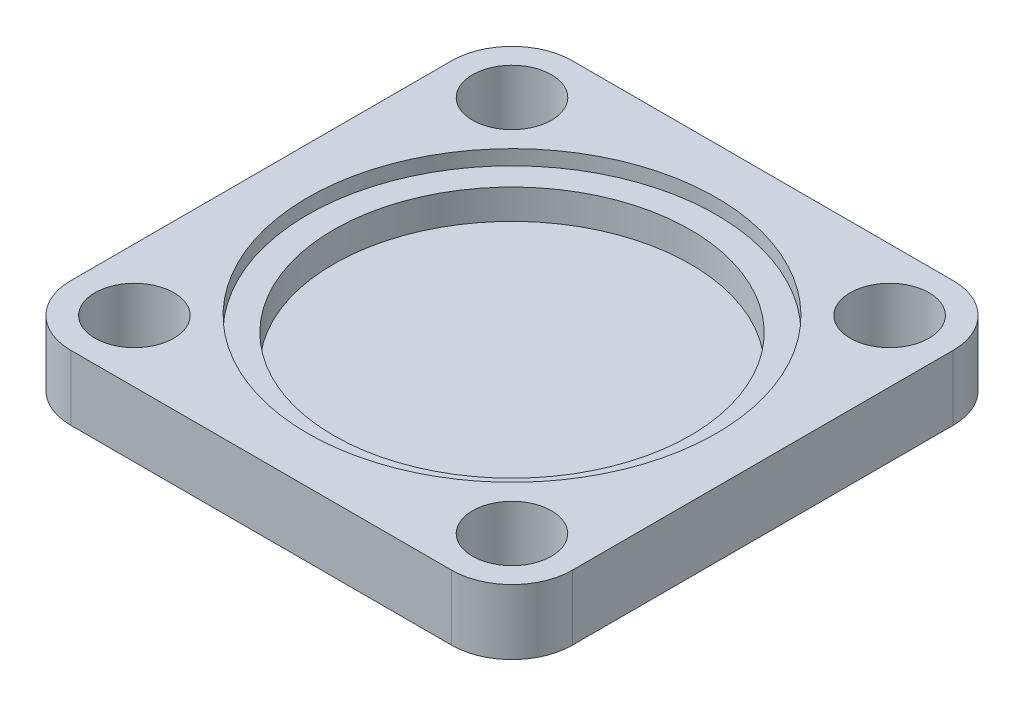
ISO-10303-21;
HEADER;
FILE_DESCRIPTION(('STEP AP214'),'2;1');
FILE_NAME('part.step','',(''),(''),'','','');
FILE_SCHEMA(('AUTOMOTIVE_DESIGN { 1 0 10303 214 1 1 1 1 }'));
ENDSEC;
DATA;
#1=APPLICATION_CONTEXT('core data for automotive mechanical design processes');
#2=APPLICATION_PROTOCOL_DEFINITION('international standard','automotive_design',2000,#1);
#3=PRODUCT_CONTEXT('',#1,'mechanical');
#4=PRODUCT('Part','Part','',(#3));
#5=PRODUCT_RELATED_PRODUCT_CATEGORY('part','',(#4));
#6=PRODUCT_DEFINITION_FORMATION('','',#4);
#7=PRODUCT_DEFINITION_CONTEXT('part definition',#1,'design');
#8=PRODUCT_DEFINITION('design','',#6,#7);
#9=PRODUCT_DEFINITION_SHAPE('','',#8);
#10=(LENGTH_UNIT() NAMED_UNIT(*) SI_UNIT(.MILLI.,.METRE.));
#11=(NAMED_UNIT(*) PLANE_ANGLE_UNIT() SI_UNIT($,.RADIAN.));
#12=(NAMED_UNIT(*) SI_UNIT($,.STERADIAN.) SOLID_ANGLE_UNIT());
#13=UNCERTAINTY_MEASURE_WITH_UNIT(LENGTH_MEASURE(1.E-05),#10,'distance_accuracy_value','');
#14=(GEOMETRIC_REPRESENTATION_CONTEXT(3) GLOBAL_UNCERTAINTY_ASSIGNED_CONTEXT((#13)) GLOBAL_UNIT_ASSIGNED_CONTEXT((#10,
#11,#12)) REPRESENTATION_CONTEXT('',''));
#15=CARTESIAN_POINT('',(0.,0.,0.));
#16=DIRECTION('',(0.,0.,1.));
#17=DIRECTION('',(1.,0.,0.));
#18=AXIS2_PLACEMENT_3D('',#15,#16,#17);
#19=CARTESIAN_POINT('',(0.,7.,0.));
#20=DIRECTION('',(0.,1.,0.));
#21=DIRECTION('',(0.,0.,1.));
#22=AXIS2_PLACEMENT_3D('',#19,#20,#21);
#23=PLANE('',#22);
#24=CARTESIAN_POINT('',(0.,7.,0.));
#25=DIRECTION('',(0.,1.,0.));
#26=DIRECTION('',(0.,0.,1.));
#27=AXIS2_PLACEMENT_3D('',#24,#25,#26);
#28=CIRCLE('',#27,22.);
#29=CARTESIAN_POINT('',(0.,7.,22.));
#30=VERTEX_POINT('',#29);
#31=EDGE_CURVE('E196',#30,#30,#28,.T.);
#32=ORIENTED_EDGE('',*,*,#31,.F.);
#33=EDGE_LOOP('',(#32));
#34=FACE_BOUND('',#33,.T.);
#35=CARTESIAN_POINT('',(-20.3293199591132,7.,20.3293199591132));
#36=DIRECTION('',(0.,1.,0.));
#37=DIRECTION('',(0.,0.,1.));
#38=AXIS2_PLACEMENT_3D('',#35,#36,#37);
#39=CIRCLE('',#38,4.25000000000001);
#40=CARTESIAN_POINT('',(-20.3293199591132,7.,24.5793199591133));
#41=VERTEX_POINT('',#40);
#42=EDGE_CURVE('E181',#41,#41,#39,.T.);
#43=ORIENTED_EDGE('',*,*,#42,.F.);
#44=EDGE_LOOP('',(#43));
#45=FACE_BOUND('',#44,.T.);
#46=CARTESIAN_POINT('',(-20.3293199591132,7.,-20.3293199591132));
#47=DIRECTION('',(0.,1.,0.));
#48=DIRECTION('',(0.,0.,1.));
#49=AXIS2_PLACEMENT_3D('',#46,#47,#48);
#50=CIRCLE('',#49,4.25);
#51=CARTESIAN_POINT('',(-20.3293199591132,7.,-16.0793199591132));
#52=VERTEX_POINT('',#51);
#53=EDGE_CURVE('E164',#52,#52,#50,.T.);
#54=ORIENTED_EDGE('',*,*,#53,.F.);
#55=EDGE_LOOP('',(#54));
#56=FACE_BOUND('',#55,.T.);
#57=DIRECTION('',(0.,0.,1.));
#58=VECTOR('',#57,1.);
#59=CARTESIAN_POINT('',(-27.,7.,-27.));
#60=LINE('',#59,#58);
#61=CARTESIAN_POINT('',(-27.,7.,-20.5));
#62=VERTEX_POINT('',#61);
#63=CARTESIAN_POINT('',(-27.,7.,20.5));
#64=VERTEX_POINT('',#63);
#65=EDGE_CURVE('E171',#62,#64,#60,.T.);
#66=ORIENTED_EDGE('',*,*,#65,.T.);
#67=CARTESIAN_POINT('',(-20.5,7.,20.5));
#68=DIRECTION('',(0.,1.,0.));
#69=DIRECTION('',(0.,0.,1.));
#70=AXIS2_PLACEMENT_3D('',#67,#68,#69);
#71=CIRCLE('',#70,6.5);
#72=CARTESIAN_POINT('',(-20.5,7.,27.));
#73=VERTEX_POINT('',#72);
#74=EDGE_CURVE('E148',#64,#73,#71,.T.);
#75=ORIENTED_EDGE('',*,*,#74,.T.);
#76=DIRECTION('',(1.,0.,0.));
#77=VECTOR('',#76,1.);
#78=CARTESIAN_POINT('',(-27.,7.,27.));
#79=LINE('',#78,#77);
#80=CARTESIAN_POINT('',(20.5,7.,27.));
#81=VERTEX_POINT('',#80);
#82=EDGE_CURVE('E119',#73,#81,#79,.T.);
#83=ORIENTED_EDGE('',*,*,#82,.T.);
#84=CARTESIAN_POINT('',(20.5,7.,20.5));
#85=DIRECTION('',(0.,1.,0.));
#86=DIRECTION('',(0.,0.,1.));
#87=AXIS2_PLACEMENT_3D('',#84,#85,#86);
#88=CIRCLE('',#87,6.5);
#89=CARTESIAN_POINT('',(27.,7.,20.5));
#90=VERTEX_POINT('',#89);
#91=EDGE_CURVE('E146',#81,#90,#88,.T.);
#92=ORIENTED_EDGE('',*,*,#91,.T.);
#93=DIRECTION('',(0.,0.,-1.));
#94=VECTOR('',#93,1.);
#95=CARTESIAN_POINT('',(27.,7.,-27.));
#96=LINE('',#95,#94);
#97=CARTESIAN_POINT('',(27.,7.,-20.5));
#98=VERTEX_POINT('',#97);
#99=EDGE_CURVE('E126',#90,#98,#96,.T.);
#100=ORIENTED_EDGE('',*,*,#99,.T.);
#101=CARTESIAN_POINT('',(20.5,7.,-20.5));
#102=DIRECTION('',(0.,1.,0.));
#103=DIRECTION('',(0.,0.,1.));
#104=AXIS2_PLACEMENT_3D('',#101,#102,#103);
#105=CIRCLE('',#104,6.5);
#106=CARTESIAN_POINT('',(20.5,7.,-27.));
#107=VERTEX_POINT('',#106);
#108=EDGE_CURVE('E54',#98,#107,#105,.T.);
#109=ORIENTED_EDGE('',*,*,#108,.T.);
#110=DIRECTION('',(-1.,0.,0.));
#111=VECTOR('',#110,1.);
#112=CARTESIAN_POINT('',(-27.,7.,-27.));
#113=LINE('',#112,#111);
#114=CARTESIAN_POINT('',(-20.5,7.,-27.));
#115=VERTEX_POINT('',#114);
#116=EDGE_CURVE('E129',#107,#115,#113,.T.);
#117=ORIENTED_EDGE('',*,*,#116,.T.);
#118=CARTESIAN_POINT('',(-20.5,7.,-20.5));
#119=DIRECTION('',(0.,1.,0.));
#120=DIRECTION('',(0.,0.,1.));
#121=AXIS2_PLACEMENT_3D('',#118,#119,#120);
#122=CIRCLE('',#121,6.5);
#123=EDGE_CURVE('E143',#115,#62,#122,.T.);
#124=ORIENTED_EDGE('',*,*,#123,.T.);
#125=EDGE_LOOP('',(#66,#75,#83,#92,#100,#109,#117,#124));
#126=FACE_BOUND('',#125,.T.);
#127=CARTESIAN_POINT('',(20.3293199591132,7.,20.3293199591132));
#128=DIRECTION('',(0.,1.,0.));
#129=DIRECTION('',(0.,0.,-1.));
#130=AXIS2_PLACEMENT_3D('',#127,#128,#129);
#131=CIRCLE('',#130,4.25000000000001);
#132=CARTESIAN_POINT('',(20.3293199591132,7.,16.0793199591132));
#133=VERTEX_POINT('',#132);
#134=EDGE_CURVE('E176',#133,#133,#131,.T.);
#135=ORIENTED_EDGE('',*,*,#134,.F.);
#136=EDGE_LOOP('',(#135));
#137=FACE_BOUND('',#136,.T.);
#138=CARTESIAN_POINT('',(20.3293199591132,7.,-20.3293199591133));
#139=DIRECTION('',(0.,1.,0.));
#140=DIRECTION('',(0.,0.,-1.));
#141=AXIS2_PLACEMENT_3D('',#138,#139,#140);
#142=CIRCLE('',#141,4.25);
#143=CARTESIAN_POINT('',(20.3293199591132,7.,-24.5793199591133));
#144=VERTEX_POINT('',#143);
#145=EDGE_CURVE('E187',#144,#144,#142,.T.);
#146=ORIENTED_EDGE('',*,*,#145,.F.);
#147=EDGE_LOOP('',(#146));
#148=FACE_BOUND('',#147,.T.);
#149=ADVANCED_FACE('F33',(#34,#45,#56,#126,#137,#148),#23,.T.);
#150=CARTESIAN_POINT('',(0.,0.,0.));
#151=DIRECTION('',(0.,1.,0.));
#152=DIRECTION('',(0.,0.,1.));
#153=AXIS2_PLACEMENT_3D('',#150,#151,#152);
#154=PLANE('',#153);
#155=DIRECTION('',(1.,0.,0.));
#156=VECTOR('',#155,1.);
#157=CARTESIAN_POINT('',(-27.,0.,27.));
#158=LINE('',#157,#156);
#159=CARTESIAN_POINT('',(-20.5,0.,27.));
#160=VERTEX_POINT('',#159);
#161=CARTESIAN_POINT('',(20.5,0.,27.));
#162=VERTEX_POINT('',#161);
#163=EDGE_CURVE('E116',#160,#162,#158,.T.);
#164=ORIENTED_EDGE('',*,*,#163,.F.);
#165=CARTESIAN_POINT('',(-20.5,0.,20.5));
#166=DIRECTION('',(0.,1.,0.));
#167=DIRECTION('',(0.,0.,1.));
#168=AXIS2_PLACEMENT_3D('',#165,#166,#167);
#169=CIRCLE('',#168,6.5);
#170=CARTESIAN_POINT('',(-27.,0.,20.5));
#171=VERTEX_POINT('',#170);
#172=EDGE_CURVE('E99',#160,#171,#169,.F.);
#173=ORIENTED_EDGE('',*,*,#172,.T.);
#174=DIRECTION('',(0.,0.,1.));
#175=VECTOR('',#174,1.);
#176=CARTESIAN_POINT('',(-27.,0.,-27.));
#177=LINE('',#176,#175);
#178=CARTESIAN_POINT('',(-27.,0.,-20.5));
#179=VERTEX_POINT('',#178);
#180=EDGE_CURVE('E127',#179,#171,#177,.T.);
#181=ORIENTED_EDGE('',*,*,#180,.F.);
#182=CARTESIAN_POINT('',(-20.5,0.,-20.5));
#183=DIRECTION('',(0.,1.,0.));
#184=DIRECTION('',(0.,0.,1.));
#185=AXIS2_PLACEMENT_3D('',#182,#183,#184);
#186=CIRCLE('',#185,6.5);
#187=CARTESIAN_POINT('',(-20.5,0.,-27.));
#188=VERTEX_POINT('',#187);
#189=EDGE_CURVE('E120',#179,#188,#186,.F.);
#190=ORIENTED_EDGE('',*,*,#189,.T.);
#191=DIRECTION('',(-1.,0.,0.));
#192=VECTOR('',#191,1.);
#193=CARTESIAN_POINT('',(-27.,0.,-27.));
#194=LINE('',#193,#192);
#195=CARTESIAN_POINT('',(20.5,0.,-27.));
#196=VERTEX_POINT('',#195);
#197=EDGE_CURVE('E131',#196,#188,#194,.T.);
#198=ORIENTED_EDGE('',*,*,#197,.F.);
#199=CARTESIAN_POINT('',(20.5,0.,-20.5));
#200=DIRECTION('',(0.,1.,0.));
#201=DIRECTION('',(0.,0.,1.));
#202=AXIS2_PLACEMENT_3D('',#199,#200,#201);
#203=CIRCLE('',#202,6.5);
#204=CARTESIAN_POINT('',(27.,0.,-20.5));
#205=VERTEX_POINT('',#204);
#206=EDGE_CURVE('E137',#196,#205,#203,.F.);
#207=ORIENTED_EDGE('',*,*,#206,.T.);
#208=DIRECTION('',(0.,0.,-1.));
#209=VECTOR('',#208,1.);
#210=CARTESIAN_POINT('',(27.,0.,-27.));
#211=LINE('',#210,#209);
#212=CARTESIAN_POINT('',(27.,0.,20.5));
#213=VERTEX_POINT('',#212);
#214=EDGE_CURVE('E159',#213,#205,#211,.T.);
#215=ORIENTED_EDGE('',*,*,#214,.F.);
#216=CARTESIAN_POINT('',(20.5,0.,20.5));
#217=DIRECTION('',(0.,1.,0.));
#218=DIRECTION('',(0.,0.,1.));
#219=AXIS2_PLACEMENT_3D('',#216,#217,#218);
#220=CIRCLE('',#219,6.5);
#221=EDGE_CURVE('E110',#213,#162,#220,.F.);
#222=ORIENTED_EDGE('',*,*,#221,.T.);
#223=EDGE_LOOP('',(#164,#173,#181,#190,#198,#207,#215,#222));
#224=FACE_BOUND('',#223,.T.);
#225=CARTESIAN_POINT('',(-20.3293199591132,0.,-20.3293199591132));
#226=DIRECTION('',(0.,1.,0.));
#227=DIRECTION('',(0.,0.,1.));
#228=AXIS2_PLACEMENT_3D('',#225,#226,#227);
#229=CIRCLE('',#228,4.25);
#230=CARTESIAN_POINT('',(-20.3293199591132,0.,-16.0793199591132));
#231=VERTEX_POINT('',#230);
#232=EDGE_CURVE('E167',#231,#231,#229,.T.);
#233=ORIENTED_EDGE('',*,*,#232,.T.);
#234=EDGE_LOOP('',(#233));
#235=FACE_BOUND('',#234,.T.);
#236=CARTESIAN_POINT('',(20.3293199591132,0.,20.3293199591132));
#237=DIRECTION('',(0.,1.,0.));
#238=DIRECTION('',(0.,0.,-1.));
#239=AXIS2_PLACEMENT_3D('',#236,#237,#238);
#240=CIRCLE('',#239,4.25000000000001);
#241=CARTESIAN_POINT('',(20.3293199591132,0.,16.0793199591132));
#242=VERTEX_POINT('',#241);
#243=EDGE_CURVE('E178',#242,#242,#240,.T.);
#244=ORIENTED_EDGE('',*,*,#243,.T.);
#245=EDGE_LOOP('',(#244));
#246=FACE_BOUND('',#245,.T.);
#247=CARTESIAN_POINT('',(-20.3293199591132,0.,20.3293199591132));
#248=DIRECTION('',(0.,1.,0.));
#249=DIRECTION('',(0.,0.,1.));
#250=AXIS2_PLACEMENT_3D('',#247,#248,#249);
#251=CIRCLE('',#250,4.25000000000001);
#252=CARTESIAN_POINT('',(-20.3293199591132,0.,24.5793199591133));
#253=VERTEX_POINT('',#252);
#254=EDGE_CURVE('E184',#253,#253,#251,.T.);
#255=ORIENTED_EDGE('',*,*,#254,.T.);
#256=EDGE_LOOP('',(#255));
#257=FACE_BOUND('',#256,.T.);
#258=CARTESIAN_POINT('',(20.3293199591132,0.,-20.3293199591133));
#259=DIRECTION('',(0.,1.,0.));
#260=DIRECTION('',(0.,0.,-1.));
#261=AXIS2_PLACEMENT_3D('',#258,#259,#260);
#262=CIRCLE('',#261,4.25);
#263=CARTESIAN_POINT('',(20.3293199591132,0.,-24.5793199591133));
#264=VERTEX_POINT('',#263);
#265=EDGE_CURVE('E190',#264,#264,#262,.T.);
#266=ORIENTED_EDGE('',*,*,#265,.T.);
#267=EDGE_LOOP('',(#266));
#268=FACE_BOUND('',#267,.T.);
#269=ADVANCED_FACE('F123',(#224,#235,#246,#257,#268),#154,.F.);
#270=CARTESIAN_POINT('',(27.,7.,-27.));
#271=DIRECTION('',(-1.,0.,0.));
#272=DIRECTION('',(0.,0.,1.));
#273=AXIS2_PLACEMENT_3D('',#270,#271,#272);
#274=PLANE('',#273);
#275=ORIENTED_EDGE('',*,*,#99,.F.);
#276=DIRECTION('',(0.,-1.,0.));
#277=VECTOR('',#276,1.);
#278=CARTESIAN_POINT('',(27.,7.,20.5));
#279=LINE('',#278,#277);
#280=EDGE_CURVE('E152',#90,#213,#279,.T.);
#281=ORIENTED_EDGE('',*,*,#280,.T.);
#282=ORIENTED_EDGE('',*,*,#214,.T.);
#283=DIRECTION('',(0.,-1.,0.));
#284=VECTOR('',#283,1.);
#285=CARTESIAN_POINT('',(27.,7.,-20.5));
#286=LINE('',#285,#284);
#287=EDGE_CURVE('E150',#205,#98,#286,.F.);
#288=ORIENTED_EDGE('',*,*,#287,.T.);
#289=EDGE_LOOP('',(#275,#281,#282,#288));
#290=FACE_BOUND('',#289,.T.);
#291=ADVANCED_FACE('F158',(#290),#274,.F.);
#292=CARTESIAN_POINT('',(-27.,7.,-27.));
#293=DIRECTION('',(0.,0.,1.));
#294=DIRECTION('',(1.,0.,0.));
#295=AXIS2_PLACEMENT_3D('',#292,#293,#294);
#296=PLANE('',#295);
#297=ORIENTED_EDGE('',*,*,#116,.F.);
#298=DIRECTION('',(0.,-1.,0.));
#299=VECTOR('',#298,1.);
#300=CARTESIAN_POINT('',(20.5,7.,-27.));
#301=LINE('',#300,#299);
#302=EDGE_CURVE('E11',#107,#196,#301,.T.);
#303=ORIENTED_EDGE('',*,*,#302,.T.);
#304=ORIENTED_EDGE('',*,*,#197,.T.);
#305=DIRECTION('',(0.,-1.,0.));
#306=VECTOR('',#305,1.);
#307=CARTESIAN_POINT('',(-20.5,7.,-27.));
#308=LINE('',#307,#306);
#309=EDGE_CURVE('E41',#188,#115,#308,.F.);
#310=ORIENTED_EDGE('',*,*,#309,.T.);
#311=EDGE_LOOP('',(#297,#303,#304,#310));
#312=FACE_BOUND('',#311,.T.);
#313=ADVANCED_FACE('F252',(#312),#296,.F.);
#314=CARTESIAN_POINT('',(-27.,7.,-27.));
#315=DIRECTION('',(1.,0.,0.));
#316=DIRECTION('',(0.,0.,-1.));
#317=AXIS2_PLACEMENT_3D('',#314,#315,#316);
#318=PLANE('',#317);
#319=ORIENTED_EDGE('',*,*,#180,.T.);
#320=DIRECTION('',(0.,-1.,0.));
#321=VECTOR('',#320,1.);
#322=CARTESIAN_POINT('',(-27.,7.,20.5));
#323=LINE('',#322,#321);
#324=EDGE_CURVE('E104',#171,#64,#323,.F.);
#325=ORIENTED_EDGE('',*,*,#324,.T.);
#326=ORIENTED_EDGE('',*,*,#65,.F.);
#327=DIRECTION('',(0.,-1.,0.));
#328=VECTOR('',#327,1.);
#329=CARTESIAN_POINT('',(-27.,7.,-20.5));
#330=LINE('',#329,#328);
#331=EDGE_CURVE('E109',#62,#179,#330,.T.);
#332=ORIENTED_EDGE('',*,*,#331,.T.);
#333=EDGE_LOOP('',(#319,#325,#326,#332));
#334=FACE_BOUND('',#333,.T.);
#335=ADVANCED_FACE('F259',(#334),#318,.F.);
#336=CARTESIAN_POINT('',(-27.,7.,27.));
#337=DIRECTION('',(0.,0.,-1.));
#338=DIRECTION('',(-1.,0.,0.));
#339=AXIS2_PLACEMENT_3D('',#336,#337,#338);
#340=PLANE('',#339);
#341=ORIENTED_EDGE('',*,*,#82,.F.);
#342=DIRECTION('',(0.,-1.,0.));
#343=VECTOR('',#342,1.);
#344=CARTESIAN_POINT('',(-20.5,7.,27.));
#345=LINE('',#344,#343);
#346=EDGE_CURVE('E103',#73,#160,#345,.T.);
#347=ORIENTED_EDGE('',*,*,#346,.T.);
#348=ORIENTED_EDGE('',*,*,#163,.T.);
#349=DIRECTION('',(0.,-1.,0.));
#350=VECTOR('',#349,1.);
#351=CARTESIAN_POINT('',(20.5,7.,27.));
#352=LINE('',#351,#350);
#353=EDGE_CURVE('E121',#162,#81,#352,.F.);
#354=ORIENTED_EDGE('',*,*,#353,.T.);
#355=EDGE_LOOP('',(#341,#347,#348,#354));
#356=FACE_BOUND('',#355,.T.);
#357=ADVANCED_FACE('F115',(#356),#340,.F.);
#358=CARTESIAN_POINT('',(-20.3293199591132,7.,-20.3293199591132));
#359=DIRECTION('',(0.,-1.,0.));
#360=DIRECTION('',(0.,0.,-1.));
#361=AXIS2_PLACEMENT_3D('',#358,#359,#360);
#362=CYLINDRICAL_SURFACE('',#361,4.25);
#363=ORIENTED_EDGE('',*,*,#53,.T.);
#364=EDGE_LOOP('',(#363));
#365=FACE_BOUND('',#364,.T.);
#366=ORIENTED_EDGE('',*,*,#232,.F.);
#367=EDGE_LOOP('',(#366));
#368=FACE_BOUND('',#367,.T.);
#369=ADVANCED_FACE('F258',(#365,#368),#362,.F.);
#370=CARTESIAN_POINT('',(20.3293199591132,7.,20.3293199591132));
#371=DIRECTION('',(0.,-1.,0.));
#372=DIRECTION('',(0.,0.,-1.));
#373=AXIS2_PLACEMENT_3D('',#370,#371,#372);
#374=CYLINDRICAL_SURFACE('',#373,4.25000000000001);
#375=ORIENTED_EDGE('',*,*,#134,.T.);
#376=EDGE_LOOP('',(#375));
#377=FACE_BOUND('',#376,.T.);
#378=ORIENTED_EDGE('',*,*,#243,.F.);
#379=EDGE_LOOP('',(#378));
#380=FACE_BOUND('',#379,.T.);
#381=ADVANCED_FACE('F338',(#377,#380),#374,.F.);
#382=CARTESIAN_POINT('',(-20.3293199591132,7.,20.3293199591132));
#383=DIRECTION('',(0.,-1.,0.));
#384=DIRECTION('',(0.,0.,-1.));
#385=AXIS2_PLACEMENT_3D('',#382,#383,#384);
#386=CYLINDRICAL_SURFACE('',#385,4.25000000000001);
#387=ORIENTED_EDGE('',*,*,#42,.T.);
#388=EDGE_LOOP('',(#387));
#389=FACE_BOUND('',#388,.T.);
#390=ORIENTED_EDGE('',*,*,#254,.F.);
#391=EDGE_LOOP('',(#390));
#392=FACE_BOUND('',#391,.T.);
#393=ADVANCED_FACE('F243',(#389,#392),#386,.F.);
#394=CARTESIAN_POINT('',(20.3293199591132,7.,-20.3293199591133));
#395=DIRECTION('',(0.,-1.,0.));
#396=DIRECTION('',(0.,0.,-1.));
#397=AXIS2_PLACEMENT_3D('',#394,#395,#396);
#398=CYLINDRICAL_SURFACE('',#397,4.25);
#399=ORIENTED_EDGE('',*,*,#145,.T.);
#400=EDGE_LOOP('',(#399));
#401=FACE_BOUND('',#400,.T.);
#402=ORIENTED_EDGE('',*,*,#265,.F.);
#403=EDGE_LOOP('',(#402));
#404=FACE_BOUND('',#403,.T.);
#405=ADVANCED_FACE('F240',(#401,#404),#398,.F.);
#406=CARTESIAN_POINT('',(-20.5,7.,20.5));
#407=DIRECTION('',(0.,-1.,0.));
#408=DIRECTION('',(0.,0.,-1.));
#409=AXIS2_PLACEMENT_3D('',#406,#407,#408);
#410=CYLINDRICAL_SURFACE('',#409,6.5);
#411=ORIENTED_EDGE('',*,*,#74,.F.);
#412=ORIENTED_EDGE('',*,*,#324,.F.);
#413=ORIENTED_EDGE('',*,*,#172,.F.);
#414=ORIENTED_EDGE('',*,*,#346,.F.);
#415=EDGE_LOOP('',(#411,#412,#413,#414));
#416=FACE_BOUND('',#415,.T.);
#417=ADVANCED_FACE('F102',(#416),#410,.T.);
#418=CARTESIAN_POINT('',(20.5,7.,20.5));
#419=DIRECTION('',(0.,-1.,0.));
#420=DIRECTION('',(0.,0.,-1.));
#421=AXIS2_PLACEMENT_3D('',#418,#419,#420);
#422=CYLINDRICAL_SURFACE('',#421,6.5);
#423=ORIENTED_EDGE('',*,*,#91,.F.);
#424=ORIENTED_EDGE('',*,*,#353,.F.);
#425=ORIENTED_EDGE('',*,*,#221,.F.);
#426=ORIENTED_EDGE('',*,*,#280,.F.);
#427=EDGE_LOOP('',(#423,#424,#425,#426));
#428=FACE_BOUND('',#427,.T.);
#429=ADVANCED_FACE('F267',(#428),#422,.T.);
#430=CARTESIAN_POINT('',(20.5,7.,-20.5));
#431=DIRECTION('',(0.,-1.,0.));
#432=DIRECTION('',(0.,0.,-1.));
#433=AXIS2_PLACEMENT_3D('',#430,#431,#432);
#434=CYLINDRICAL_SURFACE('',#433,6.5);
#435=ORIENTED_EDGE('',*,*,#108,.F.);
#436=ORIENTED_EDGE('',*,*,#287,.F.);
#437=ORIENTED_EDGE('',*,*,#206,.F.);
#438=ORIENTED_EDGE('',*,*,#302,.F.);
#439=EDGE_LOOP('',(#435,#436,#437,#438));
#440=FACE_BOUND('',#439,.T.);
#441=ADVANCED_FACE('F269',(#440),#434,.T.);
#442=CARTESIAN_POINT('',(-20.5,7.,-20.5));
#443=DIRECTION('',(0.,-1.,0.));
#444=DIRECTION('',(0.,0.,-1.));
#445=AXIS2_PLACEMENT_3D('',#442,#443,#444);
#446=CYLINDRICAL_SURFACE('',#445,6.5);
#447=ORIENTED_EDGE('',*,*,#123,.F.);
#448=ORIENTED_EDGE('',*,*,#309,.F.);
#449=ORIENTED_EDGE('',*,*,#189,.F.);
#450=ORIENTED_EDGE('',*,*,#331,.F.);
#451=EDGE_LOOP('',(#447,#448,#449,#450));
#452=FACE_BOUND('',#451,.T.);
#453=ADVANCED_FACE('F35',(#452),#446,.T.);
#454=CARTESIAN_POINT('',(0.,5.4,0.));
#455=DIRECTION('',(0.,1.,0.));
#456=DIRECTION('',(0.,0.,1.));
#457=AXIS2_PLACEMENT_3D('',#454,#455,#456);
#458=CYLINDRICAL_SURFACE('',#457,22.);
#459=CARTESIAN_POINT('',(0.,5.4,0.));
#460=DIRECTION('',(0.,1.,0.));
#461=DIRECTION('',(0.,0.,1.));
#462=AXIS2_PLACEMENT_3D('',#459,#460,#461);
#463=CIRCLE('',#462,22.);
#464=CARTESIAN_POINT('',(0.,5.4,22.));
#465=VERTEX_POINT('',#464);
#466=EDGE_CURVE('E193',#465,#465,#463,.T.);
#467=ORIENTED_EDGE('',*,*,#466,.F.);
#468=EDGE_LOOP('',(#467));
#469=FACE_BOUND('',#468,.T.);
#470=ORIENTED_EDGE('',*,*,#31,.T.);
#471=EDGE_LOOP('',(#470));
#472=FACE_BOUND('',#471,.T.);
#473=ADVANCED_FACE('F219',(#469,#472),#458,.F.);
#474=CARTESIAN_POINT('',(0.,5.4,0.));
#475=DIRECTION('',(0.,1.,0.));
#476=DIRECTION('',(0.,0.,1.));
#477=AXIS2_PLACEMENT_3D('',#474,#475,#476);
#478=PLANE('',#477);
#479=CARTESIAN_POINT('',(0.,5.4,0.));
#480=DIRECTION('',(0.,1.,0.));
#481=DIRECTION('',(0.,0.,1.));
#482=AXIS2_PLACEMENT_3D('',#479,#480,#481);
#483=CIRCLE('',#482,19.2);
#484=CARTESIAN_POINT('',(0.,5.4,19.2));
#485=VERTEX_POINT('',#484);
#486=EDGE_CURVE('E202',#485,#485,#483,.T.);
#487=ORIENTED_EDGE('',*,*,#486,.F.);
#488=EDGE_LOOP('',(#487));
#489=FACE_BOUND('',#488,.T.);
#490=ORIENTED_EDGE('',*,*,#466,.T.);
#491=EDGE_LOOP('',(#490));
#492=FACE_BOUND('',#491,.T.);
#493=ADVANCED_FACE('F213',(#489,#492),#478,.T.);
#494=CARTESIAN_POINT('',(0.,2.2,0.));
#495=DIRECTION('',(0.,1.,0.));
#496=DIRECTION('',(0.,0.,1.));
#497=AXIS2_PLACEMENT_3D('',#494,#495,#496);
#498=CYLINDRICAL_SURFACE('',#497,19.2);
#499=CARTESIAN_POINT('',(0.,2.2,0.));
#500=DIRECTION('',(0.,1.,0.));
#501=DIRECTION('',(0.,0.,1.));
#502=AXIS2_PLACEMENT_3D('',#499,#500,#501);
#503=CIRCLE('',#502,19.2);
#504=CARTESIAN_POINT('',(0.,2.2,19.2));
#505=VERTEX_POINT('',#504);
#506=EDGE_CURVE('E199',#505,#505,#503,.T.);
#507=ORIENTED_EDGE('',*,*,#506,.F.);
#508=EDGE_LOOP('',(#507));
#509=FACE_BOUND('',#508,.T.);
#510=ORIENTED_EDGE('',*,*,#486,.T.);
#511=EDGE_LOOP('',(#510));
#512=FACE_BOUND('',#511,.T.);
#513=ADVANCED_FACE('F210',(#509,#512),#498,.F.);
#514=CARTESIAN_POINT('',(0.,2.2,0.));
#515=DIRECTION('',(0.,1.,0.));
#516=DIRECTION('',(0.,0.,1.));
#517=AXIS2_PLACEMENT_3D('',#514,#515,#516);
#518=PLANE('',#517);
#519=ORIENTED_EDGE('',*,*,#506,.T.);
#520=EDGE_LOOP('',(#519));
#521=FACE_BOUND('',#520,.T.);
#522=ADVANCED_FACE('F208',(#521),#518,.T.);
#523=CLOSED_SHELL('',(#149,#269,#291,#313,#335,#357,#369,#381,#393,#405,#417,#429,#441,#453,
#473,#493,#513,#522));
#524=MANIFOLD_SOLID_BREP('B2',#523);
#525=ADVANCED_BREP_SHAPE_REPRESENTATION('',(#18,#524),#14);
#526=SHAPE_DEFINITION_REPRESENTATION(#9,#525);
ENDSEC;
END-ISO-10303-21;
